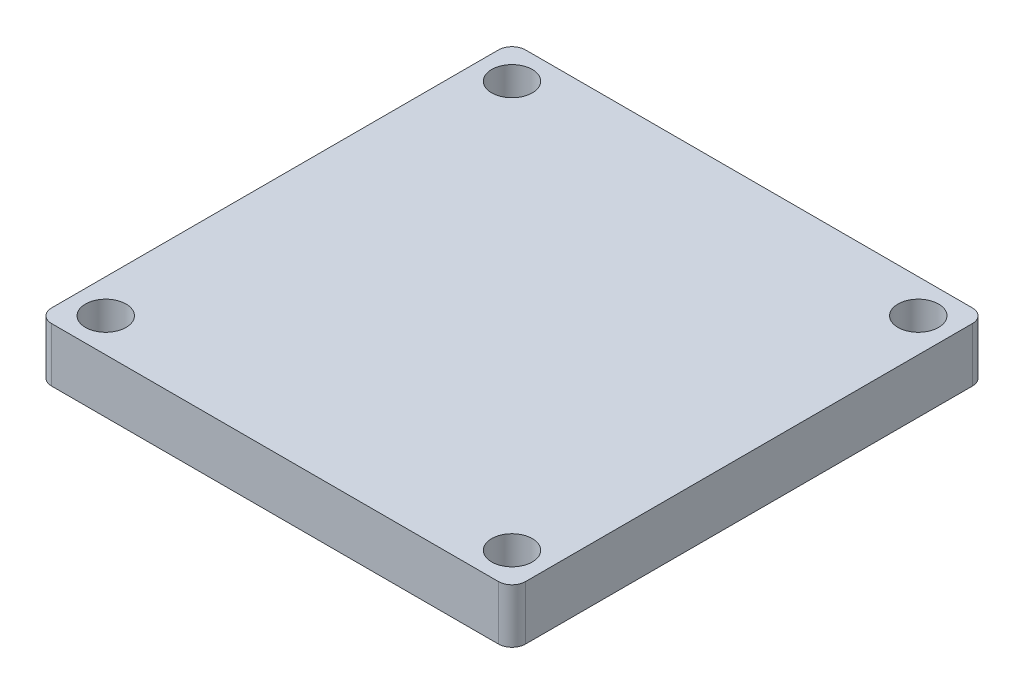
ISO-10303-21;
HEADER;
FILE_DESCRIPTION(('STEP AP214'),'2;1');
FILE_NAME('part.step','',(''),(''),'','','');
FILE_SCHEMA(('AUTOMOTIVE_DESIGN { 1 0 10303 214 1 1 1 1 }'));
ENDSEC;
DATA;
#1=APPLICATION_CONTEXT('core data for automotive mechanical design processes');
#2=APPLICATION_PROTOCOL_DEFINITION('international standard','automotive_design',2000,#1);
#3=PRODUCT_CONTEXT('',#1,'mechanical');
#4=PRODUCT('Part','Part','',(#3));
#5=PRODUCT_RELATED_PRODUCT_CATEGORY('part','',(#4));
#6=PRODUCT_DEFINITION_FORMATION('','',#4);
#7=PRODUCT_DEFINITION_CONTEXT('part definition',#1,'design');
#8=PRODUCT_DEFINITION('design','',#6,#7);
#9=PRODUCT_DEFINITION_SHAPE('','',#8);
#10=(LENGTH_UNIT() NAMED_UNIT(*) SI_UNIT(.MILLI.,.METRE.));
#11=(NAMED_UNIT(*) PLANE_ANGLE_UNIT() SI_UNIT($,.RADIAN.));
#12=(NAMED_UNIT(*) SI_UNIT($,.STERADIAN.) SOLID_ANGLE_UNIT());
#13=UNCERTAINTY_MEASURE_WITH_UNIT(LENGTH_MEASURE(1.E-05),#10,'distance_accuracy_value','');
#14=(GEOMETRIC_REPRESENTATION_CONTEXT(3) GLOBAL_UNCERTAINTY_ASSIGNED_CONTEXT((#13)) GLOBAL_UNIT_ASSIGNED_CONTEXT((#10,
#11,#12)) REPRESENTATION_CONTEXT('',''));
#15=CARTESIAN_POINT('',(0.,0.,0.));
#16=DIRECTION('',(0.,0.,1.));
#17=DIRECTION('',(1.,0.,0.));
#18=AXIS2_PLACEMENT_3D('',#15,#16,#17);
#19=CARTESIAN_POINT('',(0.,4.,0.));
#20=DIRECTION('',(0.,-1.,0.));
#21=DIRECTION('',(0.,0.,-1.));
#22=AXIS2_PLACEMENT_3D('',#19,#20,#21);
#23=PLANE('',#22);
#24=DIRECTION('',(1.,0.,0.));
#25=VECTOR('',#24,1.);
#26=CARTESIAN_POINT('',(-17.5,4.,17.5));
#27=LINE('',#26,#25);
#28=CARTESIAN_POINT('',(-16.5,4.,17.5));
#29=VERTEX_POINT('',#28);
#30=CARTESIAN_POINT('',(16.5,4.,17.5));
#31=VERTEX_POINT('',#30);
#32=EDGE_CURVE('E147',#29,#31,#27,.T.);
#33=ORIENTED_EDGE('',*,*,#32,.T.);
#34=CARTESIAN_POINT('',(16.5,4.,16.5));
#35=DIRECTION('',(0.,-1.,0.));
#36=DIRECTION('',(0.,0.,-1.));
#37=AXIS2_PLACEMENT_3D('',#34,#35,#36);
#38=CIRCLE('',#37,1.);
#39=CARTESIAN_POINT('',(17.5,4.,16.5));
#40=VERTEX_POINT('',#39);
#41=EDGE_CURVE('E177',#31,#40,#38,.F.);
#42=ORIENTED_EDGE('',*,*,#41,.T.);
#43=DIRECTION('',(0.,0.,-1.));
#44=VECTOR('',#43,1.);
#45=CARTESIAN_POINT('',(17.5,4.,17.5));
#46=LINE('',#45,#44);
#47=CARTESIAN_POINT('',(17.5,4.,-16.5));
#48=VERTEX_POINT('',#47);
#49=EDGE_CURVE('E126',#40,#48,#46,.T.);
#50=ORIENTED_EDGE('',*,*,#49,.T.);
#51=CARTESIAN_POINT('',(16.5,4.,-16.5));
#52=DIRECTION('',(0.,-1.,0.));
#53=DIRECTION('',(0.,0.,-1.));
#54=AXIS2_PLACEMENT_3D('',#51,#52,#53);
#55=CIRCLE('',#54,1.);
#56=CARTESIAN_POINT('',(16.5,4.,-17.5));
#57=VERTEX_POINT('',#56);
#58=EDGE_CURVE('E174',#48,#57,#55,.F.);
#59=ORIENTED_EDGE('',*,*,#58,.T.);
#60=DIRECTION('',(-1.,0.,0.));
#61=VECTOR('',#60,1.);
#62=CARTESIAN_POINT('',(-17.5,4.,-17.5));
#63=LINE('',#62,#61);
#64=CARTESIAN_POINT('',(-16.5,4.,-17.5));
#65=VERTEX_POINT('',#64);
#66=EDGE_CURVE('E203',#57,#65,#63,.T.);
#67=ORIENTED_EDGE('',*,*,#66,.T.);
#68=CARTESIAN_POINT('',(-16.5,4.,-16.5));
#69=DIRECTION('',(0.,-1.,0.));
#70=DIRECTION('',(0.,0.,-1.));
#71=AXIS2_PLACEMENT_3D('',#68,#69,#70);
#72=CIRCLE('',#71,1.);
#73=CARTESIAN_POINT('',(-17.5,4.,-16.5));
#74=VERTEX_POINT('',#73);
#75=EDGE_CURVE('E60',#65,#74,#72,.F.);
#76=ORIENTED_EDGE('',*,*,#75,.T.);
#77=DIRECTION('',(0.,0.,1.));
#78=VECTOR('',#77,1.);
#79=CARTESIAN_POINT('',(-17.5,4.,17.5));
#80=LINE('',#79,#78);
#81=CARTESIAN_POINT('',(-17.5,4.,16.5));
#82=VERTEX_POINT('',#81);
#83=EDGE_CURVE('E191',#74,#82,#80,.T.);
#84=ORIENTED_EDGE('',*,*,#83,.T.);
#85=CARTESIAN_POINT('',(-16.5,4.,16.5));
#86=DIRECTION('',(0.,-1.,0.));
#87=DIRECTION('',(0.,0.,-1.));
#88=AXIS2_PLACEMENT_3D('',#85,#86,#87);
#89=CIRCLE('',#88,1.);
#90=EDGE_CURVE('E171',#82,#29,#89,.F.);
#91=ORIENTED_EDGE('',*,*,#90,.T.);
#92=EDGE_LOOP('',(#33,#42,#50,#59,#67,#76,#84,#91));
#93=FACE_BOUND('',#92,.T.);
#94=CARTESIAN_POINT('',(-15.,4.,-15.));
#95=DIRECTION('',(0.,1.,0.));
#96=DIRECTION('',(0.,0.,1.));
#97=AXIS2_PLACEMENT_3D('',#94,#95,#96);
#98=CIRCLE('',#97,1.5);
#99=CARTESIAN_POINT('',(-15.,4.,-13.5));
#100=VERTEX_POINT('',#99);
#101=EDGE_CURVE('E136',#100,#100,#98,.T.);
#102=ORIENTED_EDGE('',*,*,#101,.F.);
#103=EDGE_LOOP('',(#102));
#104=FACE_BOUND('',#103,.T.);
#105=CARTESIAN_POINT('',(15.,4.,-15.));
#106=DIRECTION('',(0.,1.,0.));
#107=DIRECTION('',(0.,0.,1.));
#108=AXIS2_PLACEMENT_3D('',#105,#106,#107);
#109=CIRCLE('',#108,1.5);
#110=CARTESIAN_POINT('',(15.,4.,-13.5));
#111=VERTEX_POINT('',#110);
#112=EDGE_CURVE('E211',#111,#111,#109,.T.);
#113=ORIENTED_EDGE('',*,*,#112,.F.);
#114=EDGE_LOOP('',(#113));
#115=FACE_BOUND('',#114,.T.);
#116=CARTESIAN_POINT('',(-14.9999999999996,4.,15.));
#117=DIRECTION('',(0.,1.,0.));
#118=DIRECTION('',(0.,0.,1.));
#119=AXIS2_PLACEMENT_3D('',#116,#117,#118);
#120=CIRCLE('',#119,1.5);
#121=CARTESIAN_POINT('',(-14.9999999999996,4.,16.5));
#122=VERTEX_POINT('',#121);
#123=EDGE_CURVE('E217',#122,#122,#120,.T.);
#124=ORIENTED_EDGE('',*,*,#123,.F.);
#125=EDGE_LOOP('',(#124));
#126=FACE_BOUND('',#125,.T.);
#127=CARTESIAN_POINT('',(15.0000000000004,4.,15.));
#128=DIRECTION('',(0.,1.,0.));
#129=DIRECTION('',(0.,0.,1.));
#130=AXIS2_PLACEMENT_3D('',#127,#128,#129);
#131=CIRCLE('',#130,1.5);
#132=CARTESIAN_POINT('',(15.0000000000004,4.,16.5));
#133=VERTEX_POINT('',#132);
#134=EDGE_CURVE('E225',#133,#133,#131,.T.);
#135=ORIENTED_EDGE('',*,*,#134,.F.);
#136=EDGE_LOOP('',(#135));
#137=FACE_BOUND('',#136,.T.);
#138=ADVANCED_FACE('F39',(#93,#104,#115,#126,#137),#23,.F.);
#139=CARTESIAN_POINT('',(0.,0.,0.));
#140=DIRECTION('',(0.,-1.,0.));
#141=DIRECTION('',(0.,0.,-1.));
#142=AXIS2_PLACEMENT_3D('',#139,#140,#141);
#143=PLANE('',#142);
#144=CARTESIAN_POINT('',(-14.9999999999996,0.,15.));
#145=DIRECTION('',(0.,1.,0.));
#146=DIRECTION('',(0.,0.,1.));
#147=AXIS2_PLACEMENT_3D('',#144,#145,#146);
#148=CIRCLE('',#147,1.5);
#149=CARTESIAN_POINT('',(-14.9999999999996,0.,16.5));
#150=VERTEX_POINT('',#149);
#151=EDGE_CURVE('E221',#150,#150,#148,.T.);
#152=ORIENTED_EDGE('',*,*,#151,.T.);
#153=EDGE_LOOP('',(#152));
#154=FACE_BOUND('',#153,.T.);
#155=CARTESIAN_POINT('',(-15.,0.,-15.));
#156=DIRECTION('',(0.,1.,0.));
#157=DIRECTION('',(0.,0.,1.));
#158=AXIS2_PLACEMENT_3D('',#155,#156,#157);
#159=CIRCLE('',#158,1.5);
#160=CARTESIAN_POINT('',(-15.,0.,-13.5));
#161=VERTEX_POINT('',#160);
#162=EDGE_CURVE('E144',#161,#161,#159,.T.);
#163=ORIENTED_EDGE('',*,*,#162,.T.);
#164=EDGE_LOOP('',(#163));
#165=FACE_BOUND('',#164,.T.);
#166=DIRECTION('',(0.,0.,-1.));
#167=VECTOR('',#166,1.);
#168=CARTESIAN_POINT('',(17.5,0.,17.5));
#169=LINE('',#168,#167);
#170=CARTESIAN_POINT('',(17.5,0.,16.5));
#171=VERTEX_POINT('',#170);
#172=CARTESIAN_POINT('',(17.5,0.,-16.5));
#173=VERTEX_POINT('',#172);
#174=EDGE_CURVE('E123',#171,#173,#169,.T.);
#175=ORIENTED_EDGE('',*,*,#174,.F.);
#176=CARTESIAN_POINT('',(16.5,0.,16.5));
#177=DIRECTION('',(0.,-1.,0.));
#178=DIRECTION('',(0.,0.,-1.));
#179=AXIS2_PLACEMENT_3D('',#176,#177,#178);
#180=CIRCLE('',#179,1.);
#181=CARTESIAN_POINT('',(16.5,0.,17.5));
#182=VERTEX_POINT('',#181);
#183=EDGE_CURVE('E105',#171,#182,#180,.T.);
#184=ORIENTED_EDGE('',*,*,#183,.T.);
#185=DIRECTION('',(1.,0.,0.));
#186=VECTOR('',#185,1.);
#187=CARTESIAN_POINT('',(-17.5,0.,17.5));
#188=LINE('',#187,#186);
#189=CARTESIAN_POINT('',(-16.5,0.,17.5));
#190=VERTEX_POINT('',#189);
#191=EDGE_CURVE('E152',#190,#182,#188,.T.);
#192=ORIENTED_EDGE('',*,*,#191,.F.);
#193=CARTESIAN_POINT('',(-16.5,0.,16.5));
#194=DIRECTION('',(0.,-1.,0.));
#195=DIRECTION('',(0.,0.,-1.));
#196=AXIS2_PLACEMENT_3D('',#193,#194,#195);
#197=CIRCLE('',#196,1.);
#198=CARTESIAN_POINT('',(-17.5,0.,16.5));
#199=VERTEX_POINT('',#198);
#200=EDGE_CURVE('E159',#190,#199,#197,.T.);
#201=ORIENTED_EDGE('',*,*,#200,.T.);
#202=DIRECTION('',(0.,0.,1.));
#203=VECTOR('',#202,1.);
#204=CARTESIAN_POINT('',(-17.5,0.,17.5));
#205=LINE('',#204,#203);
#206=CARTESIAN_POINT('',(-17.5,0.,-16.5));
#207=VERTEX_POINT('',#206);
#208=EDGE_CURVE('E141',#207,#199,#205,.T.);
#209=ORIENTED_EDGE('',*,*,#208,.F.);
#210=CARTESIAN_POINT('',(-16.5,0.,-16.5));
#211=DIRECTION('',(0.,-1.,0.));
#212=DIRECTION('',(0.,0.,-1.));
#213=AXIS2_PLACEMENT_3D('',#210,#211,#212);
#214=CIRCLE('',#213,1.);
#215=CARTESIAN_POINT('',(-16.5,0.,-17.5));
#216=VERTEX_POINT('',#215);
#217=EDGE_CURVE('E128',#207,#216,#214,.T.);
#218=ORIENTED_EDGE('',*,*,#217,.T.);
#219=DIRECTION('',(-1.,0.,0.));
#220=VECTOR('',#219,1.);
#221=CARTESIAN_POINT('',(-17.5,0.,-17.5));
#222=LINE('',#221,#220);
#223=CARTESIAN_POINT('',(16.5,0.,-17.5));
#224=VERTEX_POINT('',#223);
#225=EDGE_CURVE('E135',#224,#216,#222,.T.);
#226=ORIENTED_EDGE('',*,*,#225,.F.);
#227=CARTESIAN_POINT('',(16.5,0.,-16.5));
#228=DIRECTION('',(0.,-1.,0.));
#229=DIRECTION('',(0.,0.,-1.));
#230=AXIS2_PLACEMENT_3D('',#227,#228,#229);
#231=CIRCLE('',#230,1.);
#232=EDGE_CURVE('E117',#224,#173,#231,.T.);
#233=ORIENTED_EDGE('',*,*,#232,.T.);
#234=EDGE_LOOP('',(#175,#184,#192,#201,#209,#218,#226,#233));
#235=FACE_BOUND('',#234,.T.);
#236=CARTESIAN_POINT('',(15.,0.,-15.));
#237=DIRECTION('',(0.,1.,0.));
#238=DIRECTION('',(0.,0.,1.));
#239=AXIS2_PLACEMENT_3D('',#236,#237,#238);
#240=CIRCLE('',#239,1.5);
#241=CARTESIAN_POINT('',(15.,0.,-13.5));
#242=VERTEX_POINT('',#241);
#243=EDGE_CURVE('E213',#242,#242,#240,.T.);
#244=ORIENTED_EDGE('',*,*,#243,.T.);
#245=EDGE_LOOP('',(#244));
#246=FACE_BOUND('',#245,.T.);
#247=CARTESIAN_POINT('',(15.0000000000004,0.,15.));
#248=DIRECTION('',(0.,1.,0.));
#249=DIRECTION('',(0.,0.,1.));
#250=AXIS2_PLACEMENT_3D('',#247,#248,#249);
#251=CIRCLE('',#250,1.5);
#252=CARTESIAN_POINT('',(15.0000000000004,0.,16.5));
#253=VERTEX_POINT('',#252);
#254=EDGE_CURVE('E229',#253,#253,#251,.T.);
#255=ORIENTED_EDGE('',*,*,#254,.T.);
#256=EDGE_LOOP('',(#255));
#257=FACE_BOUND('',#256,.T.);
#258=ADVANCED_FACE('F131',(#154,#165,#235,#246,#257),#143,.T.);
#259=CARTESIAN_POINT('',(17.5,4.,17.5));
#260=DIRECTION('',(-1.,0.,0.));
#261=DIRECTION('',(0.,0.,1.));
#262=AXIS2_PLACEMENT_3D('',#259,#260,#261);
#263=PLANE('',#262);
#264=ORIENTED_EDGE('',*,*,#49,.F.);
#265=DIRECTION('',(0.,-1.,0.));
#266=VECTOR('',#265,1.);
#267=CARTESIAN_POINT('',(17.5,4.,16.5));
#268=LINE('',#267,#266);
#269=EDGE_CURVE('E109',#40,#171,#268,.T.);
#270=ORIENTED_EDGE('',*,*,#269,.T.);
#271=ORIENTED_EDGE('',*,*,#174,.T.);
#272=DIRECTION('',(0.,-1.,0.));
#273=VECTOR('',#272,1.);
#274=CARTESIAN_POINT('',(17.5,4.,-16.5));
#275=LINE('',#274,#273);
#276=EDGE_CURVE('E129',#173,#48,#275,.F.);
#277=ORIENTED_EDGE('',*,*,#276,.T.);
#278=EDGE_LOOP('',(#264,#270,#271,#277));
#279=FACE_BOUND('',#278,.T.);
#280=ADVANCED_FACE('F122',(#279),#263,.F.);
#281=CARTESIAN_POINT('',(-17.5,4.,-17.5));
#282=DIRECTION('',(0.,0.,1.));
#283=DIRECTION('',(1.,0.,0.));
#284=AXIS2_PLACEMENT_3D('',#281,#282,#283);
#285=PLANE('',#284);
#286=ORIENTED_EDGE('',*,*,#66,.F.);
#287=DIRECTION('',(0.,-1.,0.));
#288=VECTOR('',#287,1.);
#289=CARTESIAN_POINT('',(16.5,4.,-17.5));
#290=LINE('',#289,#288);
#291=EDGE_CURVE('E183',#57,#224,#290,.T.);
#292=ORIENTED_EDGE('',*,*,#291,.T.);
#293=ORIENTED_EDGE('',*,*,#225,.T.);
#294=DIRECTION('',(0.,-1.,0.));
#295=VECTOR('',#294,1.);
#296=CARTESIAN_POINT('',(-16.5,4.,-17.5));
#297=LINE('',#296,#295);
#298=EDGE_CURVE('E180',#216,#65,#297,.F.);
#299=ORIENTED_EDGE('',*,*,#298,.T.);
#300=EDGE_LOOP('',(#286,#292,#293,#299));
#301=FACE_BOUND('',#300,.T.);
#302=ADVANCED_FACE('F256',(#301),#285,.F.);
#303=CARTESIAN_POINT('',(-17.5,4.,17.5));
#304=DIRECTION('',(1.,0.,0.));
#305=DIRECTION('',(0.,0.,-1.));
#306=AXIS2_PLACEMENT_3D('',#303,#304,#305);
#307=PLANE('',#306);
#308=ORIENTED_EDGE('',*,*,#208,.T.);
#309=DIRECTION('',(0.,-1.,0.));
#310=VECTOR('',#309,1.);
#311=CARTESIAN_POINT('',(-17.5,4.,16.5));
#312=LINE('',#311,#310);
#313=EDGE_CURVE('E11',#199,#82,#312,.F.);
#314=ORIENTED_EDGE('',*,*,#313,.T.);
#315=ORIENTED_EDGE('',*,*,#83,.F.);
#316=DIRECTION('',(0.,-1.,0.));
#317=VECTOR('',#316,1.);
#318=CARTESIAN_POINT('',(-17.5,4.,-16.5));
#319=LINE('',#318,#317);
#320=EDGE_CURVE('E48',#74,#207,#319,.T.);
#321=ORIENTED_EDGE('',*,*,#320,.T.);
#322=EDGE_LOOP('',(#308,#314,#315,#321));
#323=FACE_BOUND('',#322,.T.);
#324=ADVANCED_FACE('F190',(#323),#307,.F.);
#325=CARTESIAN_POINT('',(-17.5,4.,17.5));
#326=DIRECTION('',(0.,0.,-1.));
#327=DIRECTION('',(-1.,0.,0.));
#328=AXIS2_PLACEMENT_3D('',#325,#326,#327);
#329=PLANE('',#328);
#330=ORIENTED_EDGE('',*,*,#191,.T.);
#331=DIRECTION('',(0.,-1.,0.));
#332=VECTOR('',#331,1.);
#333=CARTESIAN_POINT('',(16.5,4.,17.5));
#334=LINE('',#333,#332);
#335=EDGE_CURVE('E110',#182,#31,#334,.F.);
#336=ORIENTED_EDGE('',*,*,#335,.T.);
#337=ORIENTED_EDGE('',*,*,#32,.F.);
#338=DIRECTION('',(0.,-1.,0.));
#339=VECTOR('',#338,1.);
#340=CARTESIAN_POINT('',(-16.5,4.,17.5));
#341=LINE('',#340,#339);
#342=EDGE_CURVE('E116',#29,#190,#341,.T.);
#343=ORIENTED_EDGE('',*,*,#342,.T.);
#344=EDGE_LOOP('',(#330,#336,#337,#343));
#345=FACE_BOUND('',#344,.T.);
#346=ADVANCED_FACE('F199',(#345),#329,.F.);
#347=CARTESIAN_POINT('',(-15.,4.,-15.));
#348=DIRECTION('',(0.,-1.,0.));
#349=DIRECTION('',(0.,0.,-1.));
#350=AXIS2_PLACEMENT_3D('',#347,#348,#349);
#351=CYLINDRICAL_SURFACE('',#350,1.5);
#352=ORIENTED_EDGE('',*,*,#101,.T.);
#353=EDGE_LOOP('',(#352));
#354=FACE_BOUND('',#353,.T.);
#355=ORIENTED_EDGE('',*,*,#162,.F.);
#356=EDGE_LOOP('',(#355));
#357=FACE_BOUND('',#356,.T.);
#358=ADVANCED_FACE('F249',(#354,#357),#351,.F.);
#359=CARTESIAN_POINT('',(15.,4.,-15.));
#360=DIRECTION('',(0.,-1.,0.));
#361=DIRECTION('',(0.,0.,-1.));
#362=AXIS2_PLACEMENT_3D('',#359,#360,#361);
#363=CYLINDRICAL_SURFACE('',#362,1.5);
#364=ORIENTED_EDGE('',*,*,#112,.T.);
#365=EDGE_LOOP('',(#364));
#366=FACE_BOUND('',#365,.T.);
#367=ORIENTED_EDGE('',*,*,#243,.F.);
#368=EDGE_LOOP('',(#367));
#369=FACE_BOUND('',#368,.T.);
#370=ADVANCED_FACE('F347',(#366,#369),#363,.F.);
#371=CARTESIAN_POINT('',(-14.9999999999996,4.,15.));
#372=DIRECTION('',(0.,-1.,0.));
#373=DIRECTION('',(0.,0.,-1.));
#374=AXIS2_PLACEMENT_3D('',#371,#372,#373);
#375=CYLINDRICAL_SURFACE('',#374,1.5);
#376=ORIENTED_EDGE('',*,*,#123,.T.);
#377=EDGE_LOOP('',(#376));
#378=FACE_BOUND('',#377,.T.);
#379=ORIENTED_EDGE('',*,*,#151,.F.);
#380=EDGE_LOOP('',(#379));
#381=FACE_BOUND('',#380,.T.);
#382=ADVANCED_FACE('F338',(#378,#381),#375,.F.);
#383=CARTESIAN_POINT('',(15.0000000000004,4.,15.));
#384=DIRECTION('',(0.,-1.,0.));
#385=DIRECTION('',(0.,0.,-1.));
#386=AXIS2_PLACEMENT_3D('',#383,#384,#385);
#387=CYLINDRICAL_SURFACE('',#386,1.5);
#388=ORIENTED_EDGE('',*,*,#134,.T.);
#389=EDGE_LOOP('',(#388));
#390=FACE_BOUND('',#389,.T.);
#391=ORIENTED_EDGE('',*,*,#254,.F.);
#392=EDGE_LOOP('',(#391));
#393=FACE_BOUND('',#392,.T.);
#394=ADVANCED_FACE('F237',(#390,#393),#387,.F.);
#395=CARTESIAN_POINT('',(16.5,4.,16.5));
#396=DIRECTION('',(0.,-1.,0.));
#397=DIRECTION('',(0.,0.,-1.));
#398=AXIS2_PLACEMENT_3D('',#395,#396,#397);
#399=CYLINDRICAL_SURFACE('',#398,1.);
#400=ORIENTED_EDGE('',*,*,#41,.F.);
#401=ORIENTED_EDGE('',*,*,#335,.F.);
#402=ORIENTED_EDGE('',*,*,#183,.F.);
#403=ORIENTED_EDGE('',*,*,#269,.F.);
#404=EDGE_LOOP('',(#400,#401,#402,#403));
#405=FACE_BOUND('',#404,.T.);
#406=ADVANCED_FACE('F108',(#405),#399,.T.);
#407=CARTESIAN_POINT('',(16.5,4.,-16.5));
#408=DIRECTION('',(0.,-1.,0.));
#409=DIRECTION('',(0.,0.,-1.));
#410=AXIS2_PLACEMENT_3D('',#407,#408,#409);
#411=CYLINDRICAL_SURFACE('',#410,1.);
#412=ORIENTED_EDGE('',*,*,#58,.F.);
#413=ORIENTED_EDGE('',*,*,#276,.F.);
#414=ORIENTED_EDGE('',*,*,#232,.F.);
#415=ORIENTED_EDGE('',*,*,#291,.F.);
#416=EDGE_LOOP('',(#412,#413,#414,#415));
#417=FACE_BOUND('',#416,.T.);
#418=ADVANCED_FACE('F264',(#417),#411,.T.);
#419=CARTESIAN_POINT('',(-16.5,4.,16.5));
#420=DIRECTION('',(0.,-1.,0.));
#421=DIRECTION('',(0.,0.,-1.));
#422=AXIS2_PLACEMENT_3D('',#419,#420,#421);
#423=CYLINDRICAL_SURFACE('',#422,1.);
#424=ORIENTED_EDGE('',*,*,#90,.F.);
#425=ORIENTED_EDGE('',*,*,#313,.F.);
#426=ORIENTED_EDGE('',*,*,#200,.F.);
#427=ORIENTED_EDGE('',*,*,#342,.F.);
#428=EDGE_LOOP('',(#424,#425,#426,#427));
#429=FACE_BOUND('',#428,.T.);
#430=ADVANCED_FACE('F196',(#429),#423,.T.);
#431=CARTESIAN_POINT('',(-16.5,4.,-16.5));
#432=DIRECTION('',(0.,-1.,0.));
#433=DIRECTION('',(0.,0.,-1.));
#434=AXIS2_PLACEMENT_3D('',#431,#432,#433);
#435=CYLINDRICAL_SURFACE('',#434,1.);
#436=ORIENTED_EDGE('',*,*,#75,.F.);
#437=ORIENTED_EDGE('',*,*,#298,.F.);
#438=ORIENTED_EDGE('',*,*,#217,.F.);
#439=ORIENTED_EDGE('',*,*,#320,.F.);
#440=EDGE_LOOP('',(#436,#437,#438,#439));
#441=FACE_BOUND('',#440,.T.);
#442=ADVANCED_FACE('F41',(#441),#435,.T.);
#443=CLOSED_SHELL('',(#138,#258,#280,#302,#324,#346,#358,#370,#382,#394,#406,#418,#430,#442));
#444=MANIFOLD_SOLID_BREP('B2',#443);
#445=ADVANCED_BREP_SHAPE_REPRESENTATION('',(#18,#444),#14);
#446=SHAPE_DEFINITION_REPRESENTATION(#9,#445);
ENDSEC;
END-ISO-10303-21;
